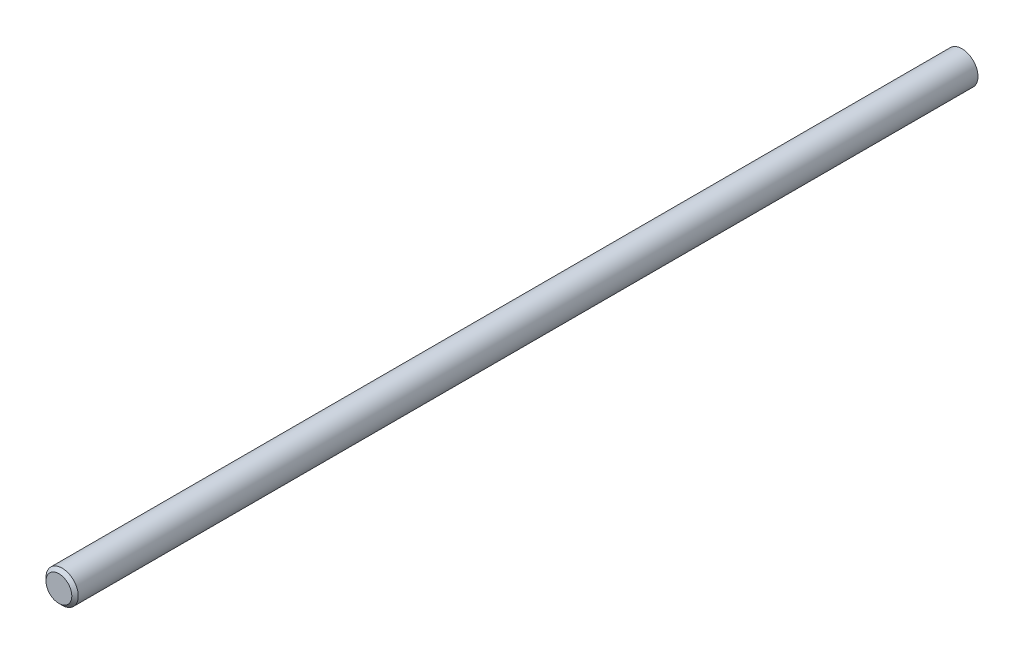
ISO-10303-21;
HEADER;
FILE_DESCRIPTION(('STEP AP214'),'2;1');
FILE_NAME('part.step','',(''),(''),'','','');
FILE_SCHEMA(('AUTOMOTIVE_DESIGN { 1 0 10303 214 1 1 1 1 }'));
ENDSEC;
DATA;
#1=APPLICATION_CONTEXT('core data for automotive mechanical design processes');
#2=APPLICATION_PROTOCOL_DEFINITION('international standard','automotive_design',2000,#1);
#3=PRODUCT_CONTEXT('',#1,'mechanical');
#4=PRODUCT('Part','Part','',(#3));
#5=PRODUCT_RELATED_PRODUCT_CATEGORY('part','',(#4));
#6=PRODUCT_DEFINITION_FORMATION('','',#4);
#7=PRODUCT_DEFINITION_CONTEXT('part definition',#1,'design');
#8=PRODUCT_DEFINITION('design','',#6,#7);
#9=PRODUCT_DEFINITION_SHAPE('','',#8);
#10=(LENGTH_UNIT() NAMED_UNIT(*) SI_UNIT(.MILLI.,.METRE.));
#11=(NAMED_UNIT(*) PLANE_ANGLE_UNIT() SI_UNIT($,.RADIAN.));
#12=(NAMED_UNIT(*) SI_UNIT($,.STERADIAN.) SOLID_ANGLE_UNIT());
#13=UNCERTAINTY_MEASURE_WITH_UNIT(LENGTH_MEASURE(1.E-05),#10,'distance_accuracy_value','');
#14=(GEOMETRIC_REPRESENTATION_CONTEXT(3) GLOBAL_UNCERTAINTY_ASSIGNED_CONTEXT((#13)) GLOBAL_UNIT_ASSIGNED_CONTEXT((#10,
#11,#12)) REPRESENTATION_CONTEXT('',''));
#15=CARTESIAN_POINT('',(0.,0.,0.));
#16=DIRECTION('',(0.,0.,1.));
#17=DIRECTION('',(1.,0.,0.));
#18=AXIS2_PLACEMENT_3D('',#15,#16,#17);
#19=CARTESIAN_POINT('',(0.,0.,280.));
#20=DIRECTION('',(0.,0.,-1.));
#21=DIRECTION('',(-1.,0.,0.));
#22=AXIS2_PLACEMENT_3D('',#19,#20,#21);
#23=CYLINDRICAL_SURFACE('',#22,5.);
#24=CARTESIAN_POINT('',(0.,0.,279.));
#25=DIRECTION('',(0.,0.,1.));
#26=DIRECTION('',(1.,0.,0.));
#27=AXIS2_PLACEMENT_3D('',#24,#25,#26);
#28=CIRCLE('',#27,5.);
#29=CARTESIAN_POINT('',(5.,0.,279.));
#30=VERTEX_POINT('',#29);
#31=EDGE_CURVE('E10',#30,#30,#28,.F.);
#32=ORIENTED_EDGE('',*,*,#31,.T.);
#33=EDGE_LOOP('',(#32));
#34=FACE_BOUND('',#33,.T.);
#35=CARTESIAN_POINT('',(0.,0.,0.));
#36=DIRECTION('',(0.,0.,1.));
#37=DIRECTION('',(1.,0.,0.));
#38=AXIS2_PLACEMENT_3D('',#35,#36,#37);
#39=CIRCLE('',#38,5.);
#40=CARTESIAN_POINT('',(5.,0.,0.));
#41=VERTEX_POINT('',#40);
#42=EDGE_CURVE('E42',#41,#41,#39,.T.);
#43=ORIENTED_EDGE('',*,*,#42,.T.);
#44=EDGE_LOOP('',(#43));
#45=FACE_BOUND('',#44,.T.);
#46=ADVANCED_FACE('F31',(#34,#45),#23,.T.);
#47=CARTESIAN_POINT('',(0.,0.,280.));
#48=DIRECTION('',(0.,0.,1.));
#49=DIRECTION('',(1.,0.,0.));
#50=AXIS2_PLACEMENT_3D('',#47,#48,#49);
#51=PLANE('',#50);
#52=CARTESIAN_POINT('',(0.,0.,280.));
#53=DIRECTION('',(0.,0.,1.));
#54=DIRECTION('',(1.,0.,0.));
#55=AXIS2_PLACEMENT_3D('',#52,#53,#54);
#56=CIRCLE('',#55,3.99999999999995);
#57=CARTESIAN_POINT('',(3.99999999999995,0.,280.));
#58=VERTEX_POINT('',#57);
#59=EDGE_CURVE('E38',#58,#58,#56,.T.);
#60=ORIENTED_EDGE('',*,*,#59,.T.);
#61=EDGE_LOOP('',(#60));
#62=FACE_BOUND('',#61,.T.);
#63=ADVANCED_FACE('F52',(#62),#51,.T.);
#64=CARTESIAN_POINT('',(0.,0.,0.));
#65=DIRECTION('',(0.,0.,1.));
#66=DIRECTION('',(1.,0.,0.));
#67=AXIS2_PLACEMENT_3D('',#64,#65,#66);
#68=PLANE('',#67);
#69=ORIENTED_EDGE('',*,*,#42,.F.);
#70=EDGE_LOOP('',(#69));
#71=FACE_BOUND('',#70,.T.);
#72=ADVANCED_FACE('F50',(#71),#68,.F.);
#73=CARTESIAN_POINT('',(0.,0.,280.));
#74=DIRECTION('',(0.,0.,-1.));
#75=DIRECTION('',(-1.,0.,0.));
#76=AXIS2_PLACEMENT_3D('',#73,#74,#75);
#77=CONICAL_SURFACE('',#76,3.99999999999995,0.785398163397446);
#78=ORIENTED_EDGE('',*,*,#31,.F.);
#79=EDGE_LOOP('',(#78));
#80=FACE_BOUND('',#79,.T.);
#81=ORIENTED_EDGE('',*,*,#59,.F.);
#82=EDGE_LOOP('',(#81));
#83=FACE_BOUND('',#82,.T.);
#84=ADVANCED_FACE('F33',(#80,#83),#77,.T.);
#85=CLOSED_SHELL('',(#46,#63,#72,#84));
#86=MANIFOLD_SOLID_BREP('B2',#85);
#87=ADVANCED_BREP_SHAPE_REPRESENTATION('',(#18,#86),#14);
#88=SHAPE_DEFINITION_REPRESENTATION(#9,#87);
ENDSEC;
END-ISO-10303-21;
